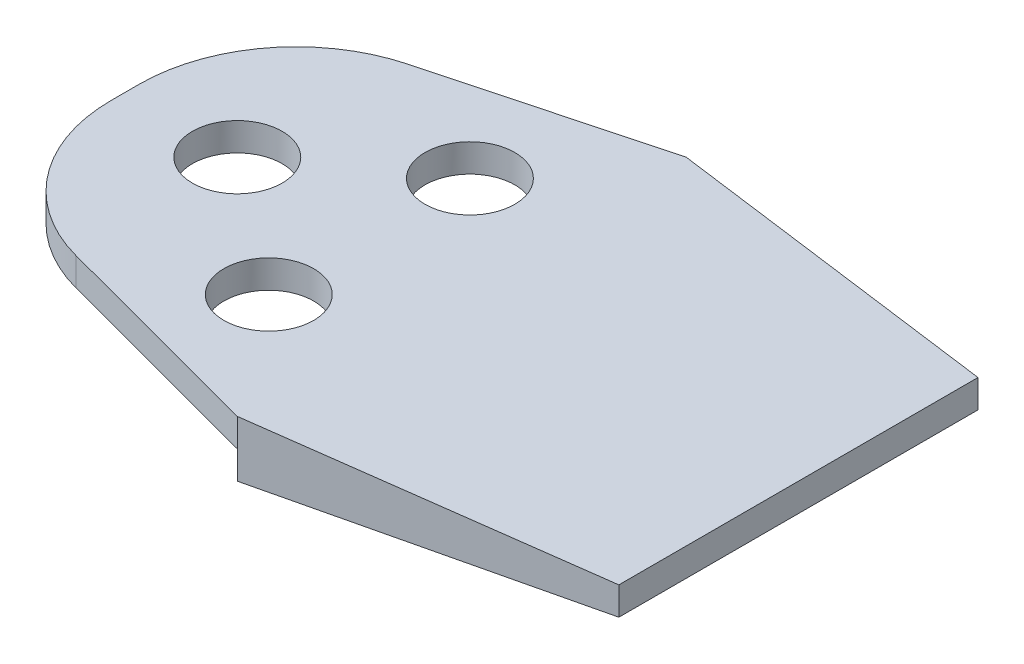
ISO-10303-21;
HEADER;
FILE_DESCRIPTION(('STEP AP214'),'2;1');
FILE_NAME('part.step','',(''),(''),'','','');
FILE_SCHEMA(('AUTOMOTIVE_DESIGN { 1 0 10303 214 1 1 1 1 }'));
ENDSEC;
DATA;
#1=APPLICATION_CONTEXT('core data for automotive mechanical design processes');
#2=APPLICATION_PROTOCOL_DEFINITION('international standard','automotive_design',2000,#1);
#3=PRODUCT_CONTEXT('',#1,'mechanical');
#4=PRODUCT('Part','Part','',(#3));
#5=PRODUCT_RELATED_PRODUCT_CATEGORY('part','',(#4));
#6=PRODUCT_DEFINITION_FORMATION('','',#4);
#7=PRODUCT_DEFINITION_CONTEXT('part definition',#1,'design');
#8=PRODUCT_DEFINITION('design','',#6,#7);
#9=PRODUCT_DEFINITION_SHAPE('','',#8);
#10=(LENGTH_UNIT() NAMED_UNIT(*) SI_UNIT(.MILLI.,.METRE.));
#11=(NAMED_UNIT(*) PLANE_ANGLE_UNIT() SI_UNIT($,.RADIAN.));
#12=(NAMED_UNIT(*) SI_UNIT($,.STERADIAN.) SOLID_ANGLE_UNIT());
#13=UNCERTAINTY_MEASURE_WITH_UNIT(LENGTH_MEASURE(1.E-05),#10,'distance_accuracy_value','');
#14=(GEOMETRIC_REPRESENTATION_CONTEXT(3) GLOBAL_UNCERTAINTY_ASSIGNED_CONTEXT((#13)) GLOBAL_UNIT_ASSIGNED_CONTEXT((#10,
#11,#12)) REPRESENTATION_CONTEXT('',''));
#15=CARTESIAN_POINT('',(0.,0.,0.));
#16=DIRECTION('',(0.,0.,1.));
#17=DIRECTION('',(1.,0.,0.));
#18=AXIS2_PLACEMENT_3D('',#15,#16,#17);
#19=CARTESIAN_POINT('',(-19.05,0.,12.7));
#20=DIRECTION('',(0.,-1.,0.));
#21=DIRECTION('',(0.,0.,-1.));
#22=AXIS2_PLACEMENT_3D('',#19,#20,#21);
#23=PLANE('',#22);
#24=CARTESIAN_POINT('',(-5.08,0.,-5.54337025502119));
#25=DIRECTION('',(0.,1.,0.));
#26=DIRECTION('',(0.,0.,1.));
#27=AXIS2_PLACEMENT_3D('',#24,#25,#26);
#28=CIRCLE('',#27,2.54);
#29=CARTESIAN_POINT('',(-5.08,0.,-3.00337025502119));
#30=VERTEX_POINT('',#29);
#31=EDGE_CURVE('E213',#30,#30,#28,.T.);
#32=ORIENTED_EDGE('',*,*,#31,.F.);
#33=EDGE_LOOP('',(#32));
#34=FACE_BOUND('',#33,.T.);
#35=CARTESIAN_POINT('',(-5.08,0.,5.8377084986506));
#36=DIRECTION('',(0.,1.,0.));
#37=DIRECTION('',(0.,0.,1.));
#38=AXIS2_PLACEMENT_3D('',#35,#36,#37);
#39=CIRCLE('',#38,2.54);
#40=CARTESIAN_POINT('',(-5.08,0.,8.3777084986506));
#41=VERTEX_POINT('',#40);
#42=EDGE_CURVE('E291',#41,#41,#39,.T.);
#43=ORIENTED_EDGE('',*,*,#42,.F.);
#44=EDGE_LOOP('',(#43));
#45=FACE_BOUND('',#44,.T.);
#46=CARTESIAN_POINT('',(-12.7,0.,0.));
#47=DIRECTION('',(0.,1.,0.));
#48=DIRECTION('',(0.,0.,1.));
#49=AXIS2_PLACEMENT_3D('',#46,#47,#48);
#50=CIRCLE('',#49,2.54);
#51=CARTESIAN_POINT('',(-12.7,0.,2.54));
#52=VERTEX_POINT('',#51);
#53=EDGE_CURVE('E287',#52,#52,#50,.T.);
#54=ORIENTED_EDGE('',*,*,#53,.F.);
#55=EDGE_LOOP('',(#54));
#56=FACE_BOUND('',#55,.T.);
#57=DIRECTION('',(0.,0.,-1.));
#58=VECTOR('',#57,1.);
#59=CARTESIAN_POINT('',(-19.05,0.,12.7));
#60=LINE('',#59,#58);
#61=CARTESIAN_POINT('',(-19.05,0.,0.790005796683224));
#62=VERTEX_POINT('',#61);
#63=CARTESIAN_POINT('',(-19.05,0.,-0.790005796683226));
#64=VERTEX_POINT('',#63);
#65=EDGE_CURVE('E165',#62,#64,#60,.T.);
#66=ORIENTED_EDGE('',*,*,#65,.F.);
#67=CARTESIAN_POINT('',(-10.16,0.,0.790005796683224));
#68=DIRECTION('',(0.,-1.,0.));
#69=DIRECTION('',(0.,0.,-1.));
#70=AXIS2_PLACEMENT_3D('',#67,#68,#69);
#71=CIRCLE('',#70,8.89);
#72=CARTESIAN_POINT('',(-12.4506209634814,0.,9.37983440973831));
#73=VERTEX_POINT('',#72);
#74=EDGE_CURVE('E120',#62,#73,#71,.F.);
#75=ORIENTED_EDGE('',*,*,#74,.T.);
#76=DIRECTION('',(0.966234939601246,0.,0.257662650560332));
#77=VECTOR('',#76,1.);
#78=CARTESIAN_POINT('',(0.,0.,12.7));
#79=LINE('',#78,#77);
#80=CARTESIAN_POINT('',(0.,0.,12.7));
#81=VERTEX_POINT('',#80);
#82=EDGE_CURVE('E114',#73,#81,#79,.T.);
#83=ORIENTED_EDGE('',*,*,#82,.T.);
#84=DIRECTION('',(0.991227900682634,0.,-0.132163720091018));
#85=VECTOR('',#84,1.);
#86=CARTESIAN_POINT('',(0.,0.,12.7));
#87=LINE('',#86,#85);
#88=CARTESIAN_POINT('',(19.05,0.,10.16));
#89=VERTEX_POINT('',#88);
#90=EDGE_CURVE('E118',#81,#89,#87,.T.);
#91=ORIENTED_EDGE('',*,*,#90,.T.);
#92=DIRECTION('',(0.,0.,-1.));
#93=VECTOR('',#92,1.);
#94=CARTESIAN_POINT('',(19.05,0.,12.7));
#95=LINE('',#94,#93);
#96=CARTESIAN_POINT('',(19.05,0.,-10.16));
#97=VERTEX_POINT('',#96);
#98=EDGE_CURVE('E172',#89,#97,#95,.T.);
#99=ORIENTED_EDGE('',*,*,#98,.T.);
#100=DIRECTION('',(0.991227900682634,0.,0.132163720091018));
#101=VECTOR('',#100,1.);
#102=CARTESIAN_POINT('',(0.,0.,-12.7));
#103=LINE('',#102,#101);
#104=CARTESIAN_POINT('',(0.,0.,-12.7));
#105=VERTEX_POINT('',#104);
#106=EDGE_CURVE('E149',#105,#97,#103,.T.);
#107=ORIENTED_EDGE('',*,*,#106,.F.);
#108=DIRECTION('',(0.966234939601246,0.,-0.257662650560332));
#109=VECTOR('',#108,1.);
#110=CARTESIAN_POINT('',(0.,0.,-12.7));
#111=LINE('',#110,#109);
#112=CARTESIAN_POINT('',(-12.4506209634814,0.,-9.37983440973831));
#113=VERTEX_POINT('',#112);
#114=EDGE_CURVE('E143',#113,#105,#111,.T.);
#115=ORIENTED_EDGE('',*,*,#114,.F.);
#116=CARTESIAN_POINT('',(-10.16,0.,-0.790005796683227));
#117=DIRECTION('',(0.,-1.,0.));
#118=DIRECTION('',(0.,0.,-1.));
#119=AXIS2_PLACEMENT_3D('',#116,#117,#118);
#120=CIRCLE('',#119,8.89);
#121=EDGE_CURVE('E198',#113,#64,#120,.F.);
#122=ORIENTED_EDGE('',*,*,#121,.T.);
#123=EDGE_LOOP('',(#66,#75,#83,#91,#99,#107,#115,#122));
#124=FACE_BOUND('',#123,.T.);
#125=ADVANCED_FACE('F39',(#34,#45,#56,#124),#23,.F.);
#126=CARTESIAN_POINT('',(-19.05,-1.5875,12.7));
#127=DIRECTION('',(1.,0.,0.));
#128=DIRECTION('',(0.,0.,-1.));
#129=AXIS2_PLACEMENT_3D('',#126,#127,#128);
#130=PLANE('',#129);
#131=DIRECTION('',(0.,0.,-1.));
#132=VECTOR('',#131,1.);
#133=CARTESIAN_POINT('',(-19.05,-1.5875,12.7));
#134=LINE('',#133,#132);
#135=CARTESIAN_POINT('',(-19.05,-1.5875,0.790005796683224));
#136=VERTEX_POINT('',#135);
#137=CARTESIAN_POINT('',(-19.05,-1.5875,-0.790005796683226));
#138=VERTEX_POINT('',#137);
#139=EDGE_CURVE('E186',#136,#138,#134,.T.);
#140=ORIENTED_EDGE('',*,*,#139,.F.);
#141=DIRECTION('',(0.,1.,0.));
#142=VECTOR('',#141,1.);
#143=CARTESIAN_POINT('',(-19.05,0.,0.790005796683224));
#144=LINE('',#143,#142);
#145=EDGE_CURVE('E194',#136,#62,#144,.T.);
#146=ORIENTED_EDGE('',*,*,#145,.T.);
#147=ORIENTED_EDGE('',*,*,#65,.T.);
#148=DIRECTION('',(0.,1.,0.));
#149=VECTOR('',#148,1.);
#150=CARTESIAN_POINT('',(-19.05,-1.5875,-0.790005796683226));
#151=LINE('',#150,#149);
#152=EDGE_CURVE('E130',#64,#138,#151,.F.);
#153=ORIENTED_EDGE('',*,*,#152,.T.);
#154=EDGE_LOOP('',(#140,#146,#147,#153));
#155=FACE_BOUND('',#154,.T.);
#156=ADVANCED_FACE('F237',(#155),#130,.F.);
#157=CARTESIAN_POINT('',(0.,-1.5875,12.7));
#158=DIRECTION('',(0.,1.,0.));
#159=DIRECTION('',(-1.,0.,0.));
#160=AXIS2_PLACEMENT_3D('',#157,#158,#159);
#161=PLANE('',#160);
#162=CARTESIAN_POINT('',(-5.08,-1.5875,-5.54337025502119));
#163=DIRECTION('',(0.,1.,0.));
#164=DIRECTION('',(-1.,0.,0.));
#165=AXIS2_PLACEMENT_3D('',#162,#163,#164);
#166=CIRCLE('',#165,2.54);
#167=CARTESIAN_POINT('',(-7.62,-1.5875,-5.54337025502119));
#168=VERTEX_POINT('',#167);
#169=EDGE_CURVE('E43',#168,#168,#166,.T.);
#170=ORIENTED_EDGE('',*,*,#169,.T.);
#171=EDGE_LOOP('',(#170));
#172=FACE_BOUND('',#171,.T.);
#173=CARTESIAN_POINT('',(-5.08,-1.5875,5.8377084986506));
#174=DIRECTION('',(0.,1.,0.));
#175=DIRECTION('',(-1.,0.,0.));
#176=AXIS2_PLACEMENT_3D('',#173,#174,#175);
#177=CIRCLE('',#176,2.54);
#178=CARTESIAN_POINT('',(-7.62,-1.5875,5.8377084986506));
#179=VERTEX_POINT('',#178);
#180=EDGE_CURVE('E212',#179,#179,#177,.T.);
#181=ORIENTED_EDGE('',*,*,#180,.T.);
#182=EDGE_LOOP('',(#181));
#183=FACE_BOUND('',#182,.T.);
#184=CARTESIAN_POINT('',(-12.7,-1.5875,0.));
#185=DIRECTION('',(0.,1.,0.));
#186=DIRECTION('',(-1.,0.,0.));
#187=AXIS2_PLACEMENT_3D('',#184,#185,#186);
#188=CIRCLE('',#187,2.54);
#189=CARTESIAN_POINT('',(-15.24,-1.5875,0.));
#190=VERTEX_POINT('',#189);
#191=EDGE_CURVE('E209',#190,#190,#188,.T.);
#192=ORIENTED_EDGE('',*,*,#191,.T.);
#193=EDGE_LOOP('',(#192));
#194=FACE_BOUND('',#193,.T.);
#195=DIRECTION('',(0.966234939601246,0.,0.257662650560332));
#196=VECTOR('',#195,1.);
#197=CARTESIAN_POINT('',(0.,-1.5875,12.7));
#198=LINE('',#197,#196);
#199=CARTESIAN_POINT('',(-12.4506209634814,-1.5875,9.3798344097383));
#200=VERTEX_POINT('',#199);
#201=CARTESIAN_POINT('',(0.,-1.5875,12.7));
#202=VERTEX_POINT('',#201);
#203=EDGE_CURVE('E122',#200,#202,#198,.T.);
#204=ORIENTED_EDGE('',*,*,#203,.F.);
#205=CARTESIAN_POINT('',(-10.16,-1.5875,0.790005796683224));
#206=DIRECTION('',(0.,1.,0.));
#207=DIRECTION('',(-1.,0.,0.));
#208=AXIS2_PLACEMENT_3D('',#205,#206,#207);
#209=CIRCLE('',#208,8.89);
#210=EDGE_CURVE('E49',#200,#136,#209,.F.);
#211=ORIENTED_EDGE('',*,*,#210,.T.);
#212=ORIENTED_EDGE('',*,*,#139,.T.);
#213=CARTESIAN_POINT('',(-10.16,-1.5875,-0.790005796683227));
#214=DIRECTION('',(0.,1.,0.));
#215=DIRECTION('',(-1.,0.,0.));
#216=AXIS2_PLACEMENT_3D('',#213,#214,#215);
#217=CIRCLE('',#216,8.89);
#218=CARTESIAN_POINT('',(-12.4506209634814,-1.5875,-9.37983440973831));
#219=VERTEX_POINT('',#218);
#220=EDGE_CURVE('E57',#138,#219,#217,.F.);
#221=ORIENTED_EDGE('',*,*,#220,.T.);
#222=DIRECTION('',(0.966234939601246,0.,-0.257662650560332));
#223=VECTOR('',#222,1.);
#224=CARTESIAN_POINT('',(-6.32365145228216,-1.5875,-11.0136929460581));
#225=LINE('',#224,#223);
#226=CARTESIAN_POINT('',(0.,-1.5875,-12.7));
#227=VERTEX_POINT('',#226);
#228=EDGE_CURVE('E137',#219,#227,#225,.T.);
#229=ORIENTED_EDGE('',*,*,#228,.T.);
#230=DIRECTION('',(0.,0.,-1.));
#231=VECTOR('',#230,1.);
#232=CARTESIAN_POINT('',(0.,-1.5875,12.7));
#233=LINE('',#232,#231);
#234=EDGE_CURVE('E182',#202,#227,#233,.T.);
#235=ORIENTED_EDGE('',*,*,#234,.F.);
#236=EDGE_LOOP('',(#204,#211,#212,#221,#229,#235));
#237=FACE_BOUND('',#236,.T.);
#238=ADVANCED_FACE('F222',(#172,#183,#194,#237),#161,.F.);
#239=CARTESIAN_POINT('',(19.05,-1.5875,12.7));
#240=DIRECTION('',(-0.0830454798537399,0.99654575824488,0.));
#241=DIRECTION('',(-0.99654575824488,-0.0830454798537399,0.));
#242=AXIS2_PLACEMENT_3D('',#239,#240,#241);
#243=PLANE('',#242);
#244=DIRECTION('',(0.987863462557455,0.0823219552131212,-0.131715128340994));
#245=VECTOR('',#244,1.);
#246=CARTESIAN_POINT('',(18.7195039306045,-1.61504133911629,10.2040661425861));
#247=LINE('',#246,#245);
#248=CARTESIAN_POINT('',(0.,-3.175,12.7));
#249=VERTEX_POINT('',#248);
#250=CARTESIAN_POINT('',(19.05,-1.5875,10.16));
#251=VERTEX_POINT('',#250);
#252=EDGE_CURVE('E141',#249,#251,#247,.T.);
#253=ORIENTED_EDGE('',*,*,#252,.F.);
#254=DIRECTION('',(0.,0.,-1.));
#255=VECTOR('',#254,1.);
#256=CARTESIAN_POINT('',(0.,-3.175,12.7));
#257=LINE('',#256,#255);
#258=CARTESIAN_POINT('',(0.,-3.175,-12.7));
#259=VERTEX_POINT('',#258);
#260=EDGE_CURVE('E178',#249,#259,#257,.T.);
#261=ORIENTED_EDGE('',*,*,#260,.T.);
#262=DIRECTION('',(0.987863462557455,0.0823219552131212,0.131715128340994));
#263=VECTOR('',#262,1.);
#264=CARTESIAN_POINT('',(22.0244646245595,-1.33962794795337,-9.7634047167254));
#265=LINE('',#264,#263);
#266=CARTESIAN_POINT('',(19.05,-1.5875,-10.16));
#267=VERTEX_POINT('',#266);
#268=EDGE_CURVE('E157',#259,#267,#265,.T.);
#269=ORIENTED_EDGE('',*,*,#268,.T.);
#270=DIRECTION('',(0.,0.,-1.));
#271=VECTOR('',#270,1.);
#272=CARTESIAN_POINT('',(19.05,-1.5875,12.7));
#273=LINE('',#272,#271);
#274=EDGE_CURVE('E175',#251,#267,#273,.T.);
#275=ORIENTED_EDGE('',*,*,#274,.F.);
#276=EDGE_LOOP('',(#253,#261,#269,#275));
#277=FACE_BOUND('',#276,.T.);
#278=ADVANCED_FACE('F255',(#277),#243,.F.);
#279=CARTESIAN_POINT('',(19.05,0.,12.7));
#280=DIRECTION('',(-1.,0.,0.));
#281=DIRECTION('',(0.,0.,1.));
#282=AXIS2_PLACEMENT_3D('',#279,#280,#281);
#283=PLANE('',#282);
#284=DIRECTION('',(0.,1.,0.));
#285=VECTOR('',#284,1.);
#286=CARTESIAN_POINT('',(19.05,-25.4,10.16));
#287=LINE('',#286,#285);
#288=EDGE_CURVE('E135',#251,#89,#287,.T.);
#289=ORIENTED_EDGE('',*,*,#288,.F.);
#290=ORIENTED_EDGE('',*,*,#274,.T.);
#291=DIRECTION('',(0.,1.,0.));
#292=VECTOR('',#291,1.);
#293=CARTESIAN_POINT('',(19.05,-25.4,-10.16));
#294=LINE('',#293,#292);
#295=EDGE_CURVE('E153',#267,#97,#294,.T.);
#296=ORIENTED_EDGE('',*,*,#295,.T.);
#297=ORIENTED_EDGE('',*,*,#98,.F.);
#298=EDGE_LOOP('',(#289,#290,#296,#297));
#299=FACE_BOUND('',#298,.T.);
#300=ADVANCED_FACE('F251',(#299),#283,.F.);
#301=CARTESIAN_POINT('',(0.,-3.175,12.7));
#302=DIRECTION('',(1.,0.,0.));
#303=DIRECTION('',(0.,0.,-1.));
#304=AXIS2_PLACEMENT_3D('',#301,#302,#303);
#305=PLANE('',#304);
#306=DIRECTION('',(0.,-1.,0.));
#307=VECTOR('',#306,1.);
#308=CARTESIAN_POINT('',(0.,-3.175,-12.7));
#309=LINE('',#308,#307);
#310=EDGE_CURVE('E161',#227,#259,#309,.T.);
#311=ORIENTED_EDGE('',*,*,#310,.T.);
#312=ORIENTED_EDGE('',*,*,#260,.F.);
#313=DIRECTION('',(0.,-1.,0.));
#314=VECTOR('',#313,1.);
#315=CARTESIAN_POINT('',(0.,-3.175,12.7));
#316=LINE('',#315,#314);
#317=EDGE_CURVE('E162',#202,#249,#316,.T.);
#318=ORIENTED_EDGE('',*,*,#317,.F.);
#319=ORIENTED_EDGE('',*,*,#234,.T.);
#320=EDGE_LOOP('',(#311,#312,#318,#319));
#321=FACE_BOUND('',#320,.T.);
#322=ADVANCED_FACE('F254',(#321),#305,.F.);
#323=CARTESIAN_POINT('',(0.,-25.4,-12.7));
#324=DIRECTION('',(-0.132163720091018,0.,0.991227900682635));
#325=DIRECTION('',(0.991227900682635,0.,0.132163720091018));
#326=AXIS2_PLACEMENT_3D('',#323,#324,#325);
#327=PLANE('',#326);
#328=ORIENTED_EDGE('',*,*,#310,.F.);
#329=DIRECTION('',(0.,1.,0.));
#330=VECTOR('',#329,1.);
#331=CARTESIAN_POINT('',(0.,0.,-12.7));
#332=LINE('',#331,#330);
#333=EDGE_CURVE('E131',#227,#105,#332,.T.);
#334=ORIENTED_EDGE('',*,*,#333,.T.);
#335=ORIENTED_EDGE('',*,*,#106,.T.);
#336=ORIENTED_EDGE('',*,*,#295,.F.);
#337=ORIENTED_EDGE('',*,*,#268,.F.);
#338=EDGE_LOOP('',(#328,#334,#335,#336,#337));
#339=FACE_BOUND('',#338,.T.);
#340=ADVANCED_FACE('F249',(#339),#327,.F.);
#341=CARTESIAN_POINT('',(0.,-25.4,12.7));
#342=DIRECTION('',(0.132163720091018,0.,0.991227900682635));
#343=DIRECTION('',(0.991227900682635,0.,-0.132163720091018));
#344=AXIS2_PLACEMENT_3D('',#341,#342,#343);
#345=PLANE('',#344);
#346=ORIENTED_EDGE('',*,*,#252,.T.);
#347=ORIENTED_EDGE('',*,*,#288,.T.);
#348=ORIENTED_EDGE('',*,*,#90,.F.);
#349=DIRECTION('',(0.,-1.,0.));
#350=VECTOR('',#349,1.);
#351=CARTESIAN_POINT('',(0.,0.,12.7));
#352=LINE('',#351,#350);
#353=EDGE_CURVE('E125',#81,#202,#352,.T.);
#354=ORIENTED_EDGE('',*,*,#353,.T.);
#355=ORIENTED_EDGE('',*,*,#317,.T.);
#356=EDGE_LOOP('',(#346,#347,#348,#354,#355));
#357=FACE_BOUND('',#356,.T.);
#358=ADVANCED_FACE('F133',(#357),#345,.T.);
#359=CARTESIAN_POINT('',(0.,-25.4,-12.7));
#360=DIRECTION('',(0.257662650560332,0.,0.966234939601246));
#361=DIRECTION('',(0.966234939601246,0.,-0.257662650560332));
#362=AXIS2_PLACEMENT_3D('',#359,#360,#361);
#363=PLANE('',#362);
#364=ORIENTED_EDGE('',*,*,#228,.F.);
#365=DIRECTION('',(0.,1.,0.));
#366=VECTOR('',#365,1.);
#367=CARTESIAN_POINT('',(-12.4506209634814,-25.4,-9.3798344097383));
#368=LINE('',#367,#366);
#369=EDGE_CURVE('E11',#219,#113,#368,.T.);
#370=ORIENTED_EDGE('',*,*,#369,.T.);
#371=ORIENTED_EDGE('',*,*,#114,.T.);
#372=ORIENTED_EDGE('',*,*,#333,.F.);
#373=EDGE_LOOP('',(#364,#370,#371,#372));
#374=FACE_BOUND('',#373,.T.);
#375=ADVANCED_FACE('F272',(#374),#363,.F.);
#376=CARTESIAN_POINT('',(0.,-25.4,12.7));
#377=DIRECTION('',(-0.257662650560332,0.,0.966234939601246));
#378=DIRECTION('',(0.966234939601246,0.,0.257662650560332));
#379=AXIS2_PLACEMENT_3D('',#376,#377,#378);
#380=PLANE('',#379);
#381=ORIENTED_EDGE('',*,*,#82,.F.);
#382=DIRECTION('',(0.,1.,0.));
#383=VECTOR('',#382,1.);
#384=CARTESIAN_POINT('',(-12.4506209634814,-1.5875,9.3798344097383));
#385=LINE('',#384,#383);
#386=EDGE_CURVE('E65',#73,#200,#385,.F.);
#387=ORIENTED_EDGE('',*,*,#386,.T.);
#388=ORIENTED_EDGE('',*,*,#203,.T.);
#389=ORIENTED_EDGE('',*,*,#353,.F.);
#390=EDGE_LOOP('',(#381,#387,#388,#389));
#391=FACE_BOUND('',#390,.T.);
#392=ADVANCED_FACE('F126',(#391),#380,.T.);
#393=CARTESIAN_POINT('',(-10.16,-1.5875,0.790005796683224));
#394=DIRECTION('',(0.,-1.,0.));
#395=DIRECTION('',(0.,0.,-1.));
#396=AXIS2_PLACEMENT_3D('',#393,#394,#395);
#397=CYLINDRICAL_SURFACE('',#396,8.89);
#398=ORIENTED_EDGE('',*,*,#210,.F.);
#399=ORIENTED_EDGE('',*,*,#386,.F.);
#400=ORIENTED_EDGE('',*,*,#74,.F.);
#401=ORIENTED_EDGE('',*,*,#145,.F.);
#402=EDGE_LOOP('',(#398,#399,#400,#401));
#403=FACE_BOUND('',#402,.T.);
#404=ADVANCED_FACE('F264',(#403),#397,.T.);
#405=CARTESIAN_POINT('',(-10.16,-25.4,-0.790005796683227));
#406=DIRECTION('',(0.,1.,0.));
#407=DIRECTION('',(0.,0.,1.));
#408=AXIS2_PLACEMENT_3D('',#405,#406,#407);
#409=CYLINDRICAL_SURFACE('',#408,8.89);
#410=ORIENTED_EDGE('',*,*,#220,.F.);
#411=ORIENTED_EDGE('',*,*,#152,.F.);
#412=ORIENTED_EDGE('',*,*,#121,.F.);
#413=ORIENTED_EDGE('',*,*,#369,.F.);
#414=EDGE_LOOP('',(#410,#411,#412,#413));
#415=FACE_BOUND('',#414,.T.);
#416=ADVANCED_FACE('F41',(#415),#409,.T.);
#417=CARTESIAN_POINT('',(-12.7,-25.4,0.));
#418=DIRECTION('',(0.,1.,0.));
#419=DIRECTION('',(0.,0.,1.));
#420=AXIS2_PLACEMENT_3D('',#417,#418,#419);
#421=CYLINDRICAL_SURFACE('',#420,2.54);
#422=ORIENTED_EDGE('',*,*,#53,.T.);
#423=EDGE_LOOP('',(#422));
#424=FACE_BOUND('',#423,.T.);
#425=ORIENTED_EDGE('',*,*,#191,.F.);
#426=EDGE_LOOP('',(#425));
#427=FACE_BOUND('',#426,.T.);
#428=ADVANCED_FACE('F232',(#424,#427),#421,.F.);
#429=CARTESIAN_POINT('',(-5.08,-25.4,5.8377084986506));
#430=DIRECTION('',(0.,1.,0.));
#431=DIRECTION('',(0.,0.,1.));
#432=AXIS2_PLACEMENT_3D('',#429,#430,#431);
#433=CYLINDRICAL_SURFACE('',#432,2.54);
#434=ORIENTED_EDGE('',*,*,#42,.T.);
#435=EDGE_LOOP('',(#434));
#436=FACE_BOUND('',#435,.T.);
#437=ORIENTED_EDGE('',*,*,#180,.F.);
#438=EDGE_LOOP('',(#437));
#439=FACE_BOUND('',#438,.T.);
#440=ADVANCED_FACE('F226',(#436,#439),#433,.F.);
#441=CARTESIAN_POINT('',(-5.08,-25.4,-5.54337025502119));
#442=DIRECTION('',(0.,1.,0.));
#443=DIRECTION('',(0.,0.,1.));
#444=AXIS2_PLACEMENT_3D('',#441,#442,#443);
#445=CYLINDRICAL_SURFACE('',#444,2.54);
#446=ORIENTED_EDGE('',*,*,#31,.T.);
#447=EDGE_LOOP('',(#446));
#448=FACE_BOUND('',#447,.T.);
#449=ORIENTED_EDGE('',*,*,#169,.F.);
#450=EDGE_LOOP('',(#449));
#451=FACE_BOUND('',#450,.T.);
#452=ADVANCED_FACE('F224',(#448,#451),#445,.F.);
#453=CLOSED_SHELL('',(#125,#156,#238,#278,#300,#322,#340,#358,#375,#392,#404,#416,#428,#440,#452));
#454=MANIFOLD_SOLID_BREP('B2',#453);
#455=ADVANCED_BREP_SHAPE_REPRESENTATION('',(#18,#454),#14);
#456=SHAPE_DEFINITION_REPRESENTATION(#9,#455);
ENDSEC;
END-ISO-10303-21;
